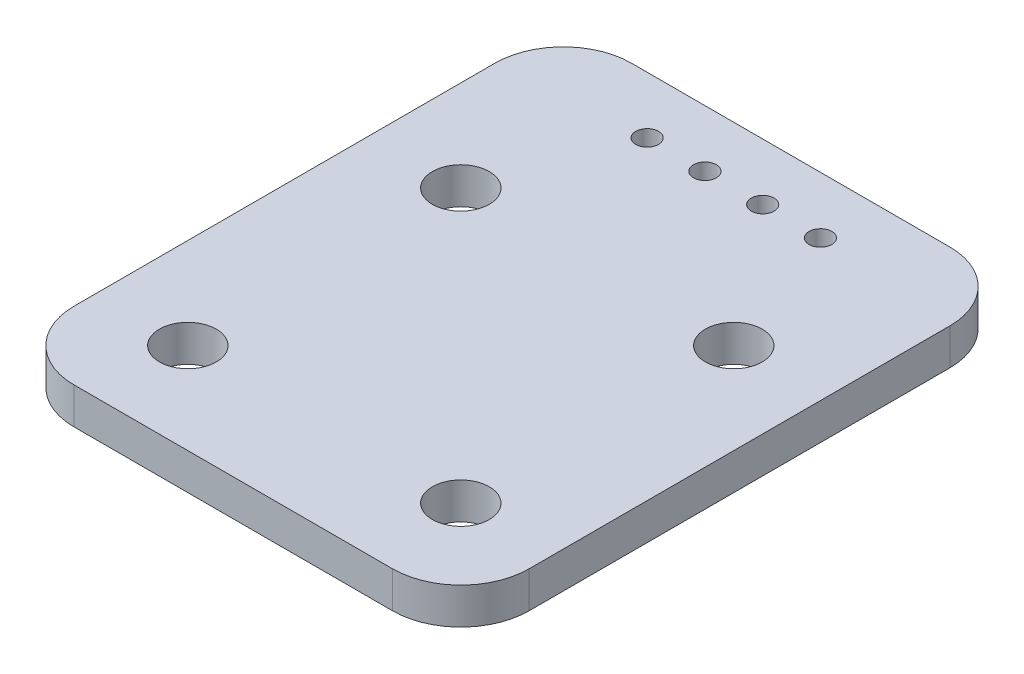
ISO-10303-21;
HEADER;
FILE_DESCRIPTION(('STEP AP214'),'2;1');
FILE_NAME('part.step','',(''),(''),'','','');
FILE_SCHEMA(('AUTOMOTIVE_DESIGN { 1 0 10303 214 1 1 1 1 }'));
ENDSEC;
DATA;
#1=APPLICATION_CONTEXT('core data for automotive mechanical design processes');
#2=APPLICATION_PROTOCOL_DEFINITION('international standard','automotive_design',2000,#1);
#3=PRODUCT_CONTEXT('',#1,'mechanical');
#4=PRODUCT('Part','Part','',(#3));
#5=PRODUCT_RELATED_PRODUCT_CATEGORY('part','',(#4));
#6=PRODUCT_DEFINITION_FORMATION('','',#4);
#7=PRODUCT_DEFINITION_CONTEXT('part definition',#1,'design');
#8=PRODUCT_DEFINITION('design','',#6,#7);
#9=PRODUCT_DEFINITION_SHAPE('','',#8);
#10=(LENGTH_UNIT() NAMED_UNIT(*) SI_UNIT(.MILLI.,.METRE.));
#11=(NAMED_UNIT(*) PLANE_ANGLE_UNIT() SI_UNIT($,.RADIAN.));
#12=(NAMED_UNIT(*) SI_UNIT($,.STERADIAN.) SOLID_ANGLE_UNIT());
#13=UNCERTAINTY_MEASURE_WITH_UNIT(LENGTH_MEASURE(1.E-05),#10,'distance_accuracy_value','');
#14=(GEOMETRIC_REPRESENTATION_CONTEXT(3) GLOBAL_UNCERTAINTY_ASSIGNED_CONTEXT((#13)) GLOBAL_UNIT_ASSIGNED_CONTEXT((#10,
#11,#12)) REPRESENTATION_CONTEXT('',''));
#15=CARTESIAN_POINT('',(0.,0.,0.));
#16=DIRECTION('',(0.,0.,1.));
#17=DIRECTION('',(1.,0.,0.));
#18=AXIS2_PLACEMENT_3D('',#15,#16,#17);
#19=CARTESIAN_POINT('',(10.,1.6,-12.25));
#20=DIRECTION('',(-1.,0.,0.));
#21=DIRECTION('',(0.,0.,1.));
#22=AXIS2_PLACEMENT_3D('',#19,#20,#21);
#23=PLANE('',#22);
#24=DIRECTION('',(0.,0.,-1.));
#25=VECTOR('',#24,1.);
#26=CARTESIAN_POINT('',(10.,0.,-12.25));
#27=LINE('',#26,#25);
#28=CARTESIAN_POINT('',(10.,0.,9.25));
#29=VERTEX_POINT('',#28);
#30=CARTESIAN_POINT('',(10.,0.,-9.25));
#31=VERTEX_POINT('',#30);
#32=EDGE_CURVE('E124',#29,#31,#27,.T.);
#33=ORIENTED_EDGE('',*,*,#32,.T.);
#34=DIRECTION('',(0.,-1.,0.));
#35=VECTOR('',#34,1.);
#36=CARTESIAN_POINT('',(10.,1.6,-9.25));
#37=LINE('',#36,#35);
#38=CARTESIAN_POINT('',(10.,1.6,-9.25));
#39=VERTEX_POINT('',#38);
#40=EDGE_CURVE('E102',#31,#39,#37,.F.);
#41=ORIENTED_EDGE('',*,*,#40,.T.);
#42=DIRECTION('',(0.,0.,-1.));
#43=VECTOR('',#42,1.);
#44=CARTESIAN_POINT('',(10.,1.6,-12.25));
#45=LINE('',#44,#43);
#46=CARTESIAN_POINT('',(10.,1.6,9.25));
#47=VERTEX_POINT('',#46);
#48=EDGE_CURVE('E134',#47,#39,#45,.T.);
#49=ORIENTED_EDGE('',*,*,#48,.F.);
#50=DIRECTION('',(0.,-1.,0.));
#51=VECTOR('',#50,1.);
#52=CARTESIAN_POINT('',(10.,1.6,9.25));
#53=LINE('',#52,#51);
#54=EDGE_CURVE('E107',#47,#29,#53,.T.);
#55=ORIENTED_EDGE('',*,*,#54,.T.);
#56=EDGE_LOOP('',(#33,#41,#49,#55));
#57=FACE_BOUND('',#56,.T.);
#58=ADVANCED_FACE('F32',(#57),#23,.F.);
#59=CARTESIAN_POINT('',(-10.,1.6,-12.25));
#60=DIRECTION('',(0.,0.,1.));
#61=DIRECTION('',(1.,0.,0.));
#62=AXIS2_PLACEMENT_3D('',#59,#60,#61);
#63=PLANE('',#62);
#64=DIRECTION('',(-1.,0.,0.));
#65=VECTOR('',#64,1.);
#66=CARTESIAN_POINT('',(-10.,1.6,-12.25));
#67=LINE('',#66,#65);
#68=CARTESIAN_POINT('',(7.,1.6,-12.25));
#69=VERTEX_POINT('',#68);
#70=CARTESIAN_POINT('',(-7.,1.6,-12.25));
#71=VERTEX_POINT('',#70);
#72=EDGE_CURVE('E117',#69,#71,#67,.T.);
#73=ORIENTED_EDGE('',*,*,#72,.F.);
#74=DIRECTION('',(0.,-1.,0.));
#75=VECTOR('',#74,1.);
#76=CARTESIAN_POINT('',(7.,1.6,-12.25));
#77=LINE('',#76,#75);
#78=CARTESIAN_POINT('',(7.,0.,-12.25));
#79=VERTEX_POINT('',#78);
#80=EDGE_CURVE('E101',#69,#79,#77,.T.);
#81=ORIENTED_EDGE('',*,*,#80,.T.);
#82=DIRECTION('',(-1.,0.,0.));
#83=VECTOR('',#82,1.);
#84=CARTESIAN_POINT('',(-10.,0.,-12.25));
#85=LINE('',#84,#83);
#86=CARTESIAN_POINT('',(-7.,0.,-12.25));
#87=VERTEX_POINT('',#86);
#88=EDGE_CURVE('E114',#79,#87,#85,.T.);
#89=ORIENTED_EDGE('',*,*,#88,.T.);
#90=DIRECTION('',(0.,-1.,0.));
#91=VECTOR('',#90,1.);
#92=CARTESIAN_POINT('',(-7.,1.6,-12.25));
#93=LINE('',#92,#91);
#94=EDGE_CURVE('E119',#87,#71,#93,.F.);
#95=ORIENTED_EDGE('',*,*,#94,.T.);
#96=EDGE_LOOP('',(#73,#81,#89,#95));
#97=FACE_BOUND('',#96,.T.);
#98=ADVANCED_FACE('F113',(#97),#63,.F.);
#99=CARTESIAN_POINT('',(-10.,1.6,-12.25));
#100=DIRECTION('',(1.,0.,0.));
#101=DIRECTION('',(0.,0.,-1.));
#102=AXIS2_PLACEMENT_3D('',#99,#100,#101);
#103=PLANE('',#102);
#104=DIRECTION('',(0.,0.,1.));
#105=VECTOR('',#104,1.);
#106=CARTESIAN_POINT('',(-10.,1.6,-12.25));
#107=LINE('',#106,#105);
#108=CARTESIAN_POINT('',(-10.,1.6,-9.25));
#109=VERTEX_POINT('',#108);
#110=CARTESIAN_POINT('',(-10.,1.6,9.25));
#111=VERTEX_POINT('',#110);
#112=EDGE_CURVE('E168',#109,#111,#107,.T.);
#113=ORIENTED_EDGE('',*,*,#112,.F.);
#114=DIRECTION('',(0.,-1.,0.));
#115=VECTOR('',#114,1.);
#116=CARTESIAN_POINT('',(-10.,1.6,-9.25));
#117=LINE('',#116,#115);
#118=CARTESIAN_POINT('',(-10.,0.,-9.25));
#119=VERTEX_POINT('',#118);
#120=EDGE_CURVE('E153',#109,#119,#117,.T.);
#121=ORIENTED_EDGE('',*,*,#120,.T.);
#122=DIRECTION('',(0.,0.,1.));
#123=VECTOR('',#122,1.);
#124=CARTESIAN_POINT('',(-10.,0.,-12.25));
#125=LINE('',#124,#123);
#126=CARTESIAN_POINT('',(-10.,0.,9.25));
#127=VERTEX_POINT('',#126);
#128=EDGE_CURVE('E123',#119,#127,#125,.T.);
#129=ORIENTED_EDGE('',*,*,#128,.T.);
#130=DIRECTION('',(0.,-1.,0.));
#131=VECTOR('',#130,1.);
#132=CARTESIAN_POINT('',(-10.,1.6,9.25));
#133=LINE('',#132,#131);
#134=EDGE_CURVE('E151',#127,#111,#133,.F.);
#135=ORIENTED_EDGE('',*,*,#134,.T.);
#136=EDGE_LOOP('',(#113,#121,#129,#135));
#137=FACE_BOUND('',#136,.T.);
#138=ADVANCED_FACE('F184',(#137),#103,.F.);
#139=CARTESIAN_POINT('',(-10.,1.6,12.25));
#140=DIRECTION('',(0.,0.,-1.));
#141=DIRECTION('',(-1.,0.,0.));
#142=AXIS2_PLACEMENT_3D('',#139,#140,#141);
#143=PLANE('',#142);
#144=DIRECTION('',(1.,0.,0.));
#145=VECTOR('',#144,1.);
#146=CARTESIAN_POINT('',(-10.,0.,12.25));
#147=LINE('',#146,#145);
#148=CARTESIAN_POINT('',(-7.,0.,12.25));
#149=VERTEX_POINT('',#148);
#150=CARTESIAN_POINT('',(7.,0.,12.25));
#151=VERTEX_POINT('',#150);
#152=EDGE_CURVE('E127',#149,#151,#147,.T.);
#153=ORIENTED_EDGE('',*,*,#152,.T.);
#154=DIRECTION('',(0.,-1.,0.));
#155=VECTOR('',#154,1.);
#156=CARTESIAN_POINT('',(7.,1.6,12.25));
#157=LINE('',#156,#155);
#158=CARTESIAN_POINT('',(7.,1.6,12.25));
#159=VERTEX_POINT('',#158);
#160=EDGE_CURVE('E11',#151,#159,#157,.F.);
#161=ORIENTED_EDGE('',*,*,#160,.T.);
#162=DIRECTION('',(1.,0.,0.));
#163=VECTOR('',#162,1.);
#164=CARTESIAN_POINT('',(-10.,1.6,12.25));
#165=LINE('',#164,#163);
#166=CARTESIAN_POINT('',(-7.,1.6,12.25));
#167=VERTEX_POINT('',#166);
#168=EDGE_CURVE('E135',#167,#159,#165,.T.);
#169=ORIENTED_EDGE('',*,*,#168,.F.);
#170=DIRECTION('',(0.,-1.,0.));
#171=VECTOR('',#170,1.);
#172=CARTESIAN_POINT('',(-7.,1.6,12.25));
#173=LINE('',#172,#171);
#174=EDGE_CURVE('E40',#167,#149,#173,.T.);
#175=ORIENTED_EDGE('',*,*,#174,.T.);
#176=EDGE_LOOP('',(#153,#161,#169,#175));
#177=FACE_BOUND('',#176,.T.);
#178=ADVANCED_FACE('F158',(#177),#143,.F.);
#179=CARTESIAN_POINT('',(0.,1.6,0.));
#180=DIRECTION('',(0.,1.,0.));
#181=DIRECTION('',(0.,0.,1.));
#182=AXIS2_PLACEMENT_3D('',#179,#180,#181);
#183=PLANE('',#182);
#184=CARTESIAN_POINT('',(-3.81,1.6,-9.75));
#185=DIRECTION('',(0.,1.,0.));
#186=DIRECTION('',(0.,0.,1.));
#187=AXIS2_PLACEMENT_3D('',#184,#185,#186);
#188=CIRCLE('',#187,0.5);
#189=CARTESIAN_POINT('',(-3.81,1.6,-9.25));
#190=VERTEX_POINT('',#189);
#191=EDGE_CURVE('E129',#190,#190,#188,.T.);
#192=ORIENTED_EDGE('',*,*,#191,.F.);
#193=EDGE_LOOP('',(#192));
#194=FACE_BOUND('',#193,.T.);
#195=CARTESIAN_POINT('',(-6.,1.6,-3.75));
#196=DIRECTION('',(0.,1.,0.));
#197=DIRECTION('',(0.,0.,1.));
#198=AXIS2_PLACEMENT_3D('',#195,#196,#197);
#199=CIRCLE('',#198,1.25);
#200=CARTESIAN_POINT('',(-6.,1.6,-2.5));
#201=VERTEX_POINT('',#200);
#202=EDGE_CURVE('E364',#201,#201,#199,.T.);
#203=ORIENTED_EDGE('',*,*,#202,.F.);
#204=EDGE_LOOP('',(#203));
#205=FACE_BOUND('',#204,.T.);
#206=CARTESIAN_POINT('',(-6.,1.6,8.25));
#207=DIRECTION('',(0.,1.,0.));
#208=DIRECTION('',(0.,0.,1.));
#209=AXIS2_PLACEMENT_3D('',#206,#207,#208);
#210=CIRCLE('',#209,1.25);
#211=CARTESIAN_POINT('',(-6.,1.6,9.5));
#212=VERTEX_POINT('',#211);
#213=EDGE_CURVE('E362',#212,#212,#210,.T.);
#214=ORIENTED_EDGE('',*,*,#213,.F.);
#215=EDGE_LOOP('',(#214));
#216=FACE_BOUND('',#215,.T.);
#217=CARTESIAN_POINT('',(6.,1.6,-3.75));
#218=DIRECTION('',(0.,1.,0.));
#219=DIRECTION('',(0.,0.,1.));
#220=AXIS2_PLACEMENT_3D('',#217,#218,#219);
#221=CIRCLE('',#220,1.25);
#222=CARTESIAN_POINT('',(6.,1.6,-2.5));
#223=VERTEX_POINT('',#222);
#224=EDGE_CURVE('E359',#223,#223,#221,.T.);
#225=ORIENTED_EDGE('',*,*,#224,.F.);
#226=EDGE_LOOP('',(#225));
#227=FACE_BOUND('',#226,.T.);
#228=CARTESIAN_POINT('',(-1.27,1.6,-9.75));
#229=DIRECTION('',(0.,1.,0.));
#230=DIRECTION('',(0.,0.,1.));
#231=AXIS2_PLACEMENT_3D('',#228,#229,#230);
#232=CIRCLE('',#231,0.5);
#233=CARTESIAN_POINT('',(-1.27,1.6,-9.25));
#234=VERTEX_POINT('',#233);
#235=EDGE_CURVE('E356',#234,#234,#232,.T.);
#236=ORIENTED_EDGE('',*,*,#235,.F.);
#237=EDGE_LOOP('',(#236));
#238=FACE_BOUND('',#237,.T.);
#239=CARTESIAN_POINT('',(1.27,1.6,-9.75));
#240=DIRECTION('',(0.,1.,0.));
#241=DIRECTION('',(0.,0.,1.));
#242=AXIS2_PLACEMENT_3D('',#239,#240,#241);
#243=CIRCLE('',#242,0.5);
#244=CARTESIAN_POINT('',(1.27,1.6,-9.25));
#245=VERTEX_POINT('',#244);
#246=EDGE_CURVE('E353',#245,#245,#243,.T.);
#247=ORIENTED_EDGE('',*,*,#246,.F.);
#248=EDGE_LOOP('',(#247));
#249=FACE_BOUND('',#248,.T.);
#250=CARTESIAN_POINT('',(3.81,1.6,-9.75000000000001));
#251=DIRECTION('',(0.,1.,0.));
#252=DIRECTION('',(0.,0.,1.));
#253=AXIS2_PLACEMENT_3D('',#250,#251,#252);
#254=CIRCLE('',#253,0.5);
#255=CARTESIAN_POINT('',(3.81,1.6,-9.25000000000001));
#256=VERTEX_POINT('',#255);
#257=EDGE_CURVE('E344',#256,#256,#254,.T.);
#258=ORIENTED_EDGE('',*,*,#257,.F.);
#259=EDGE_LOOP('',(#258));
#260=FACE_BOUND('',#259,.T.);
#261=CARTESIAN_POINT('',(6.,1.6,8.25));
#262=DIRECTION('',(0.,1.,0.));
#263=DIRECTION('',(0.,0.,1.));
#264=AXIS2_PLACEMENT_3D('',#261,#262,#263);
#265=CIRCLE('',#264,1.25);
#266=CARTESIAN_POINT('',(6.,1.6,9.5));
#267=VERTEX_POINT('',#266);
#268=EDGE_CURVE('E337',#267,#267,#265,.T.);
#269=ORIENTED_EDGE('',*,*,#268,.F.);
#270=EDGE_LOOP('',(#269));
#271=FACE_BOUND('',#270,.T.);
#272=ORIENTED_EDGE('',*,*,#48,.T.);
#273=CARTESIAN_POINT('',(7.,1.6,-9.25));
#274=DIRECTION('',(0.,1.,0.));
#275=DIRECTION('',(0.,0.,1.));
#276=AXIS2_PLACEMENT_3D('',#273,#274,#275);
#277=CIRCLE('',#276,3.);
#278=EDGE_CURVE('E149',#39,#69,#277,.T.);
#279=ORIENTED_EDGE('',*,*,#278,.T.);
#280=ORIENTED_EDGE('',*,*,#72,.T.);
#281=CARTESIAN_POINT('',(-7.,1.6,-9.25));
#282=DIRECTION('',(0.,1.,0.));
#283=DIRECTION('',(0.,0.,1.));
#284=AXIS2_PLACEMENT_3D('',#281,#282,#283);
#285=CIRCLE('',#284,3.);
#286=EDGE_CURVE('E147',#71,#109,#285,.T.);
#287=ORIENTED_EDGE('',*,*,#286,.T.);
#288=ORIENTED_EDGE('',*,*,#112,.T.);
#289=CARTESIAN_POINT('',(-7.,1.6,9.25));
#290=DIRECTION('',(0.,1.,0.));
#291=DIRECTION('',(0.,0.,1.));
#292=AXIS2_PLACEMENT_3D('',#289,#290,#291);
#293=CIRCLE('',#292,3.);
#294=EDGE_CURVE('E52',#111,#167,#293,.T.);
#295=ORIENTED_EDGE('',*,*,#294,.T.);
#296=ORIENTED_EDGE('',*,*,#168,.T.);
#297=CARTESIAN_POINT('',(7.,1.6,9.25));
#298=DIRECTION('',(0.,1.,0.));
#299=DIRECTION('',(0.,0.,1.));
#300=AXIS2_PLACEMENT_3D('',#297,#298,#299);
#301=CIRCLE('',#300,3.);
#302=EDGE_CURVE('E145',#159,#47,#301,.T.);
#303=ORIENTED_EDGE('',*,*,#302,.T.);
#304=EDGE_LOOP('',(#272,#279,#280,#287,#288,#295,#296,#303));
#305=FACE_BOUND('',#304,.T.);
#306=ADVANCED_FACE('F173',(#194,#205,#216,#227,#238,#249,#260,#271,#305),#183,.T.);
#307=CARTESIAN_POINT('',(0.,0.,0.));
#308=DIRECTION('',(0.,1.,0.));
#309=DIRECTION('',(0.,0.,1.));
#310=AXIS2_PLACEMENT_3D('',#307,#308,#309);
#311=PLANE('',#310);
#312=CARTESIAN_POINT('',(-3.81,0.,-9.75));
#313=DIRECTION('',(0.,1.,0.));
#314=DIRECTION('',(0.,0.,1.));
#315=AXIS2_PLACEMENT_3D('',#312,#313,#314);
#316=CIRCLE('',#315,0.5);
#317=CARTESIAN_POINT('',(-3.81,0.,-9.25));
#318=VERTEX_POINT('',#317);
#319=EDGE_CURVE('E371',#318,#318,#316,.T.);
#320=ORIENTED_EDGE('',*,*,#319,.T.);
#321=EDGE_LOOP('',(#320));
#322=FACE_BOUND('',#321,.T.);
#323=CARTESIAN_POINT('',(-6.,0.,-3.75));
#324=DIRECTION('',(0.,1.,0.));
#325=DIRECTION('',(0.,0.,1.));
#326=AXIS2_PLACEMENT_3D('',#323,#324,#325);
#327=CIRCLE('',#326,1.25);
#328=CARTESIAN_POINT('',(-6.,0.,-2.5));
#329=VERTEX_POINT('',#328);
#330=EDGE_CURVE('E372',#329,#329,#327,.T.);
#331=ORIENTED_EDGE('',*,*,#330,.T.);
#332=EDGE_LOOP('',(#331));
#333=FACE_BOUND('',#332,.T.);
#334=CARTESIAN_POINT('',(-6.,0.,8.25));
#335=DIRECTION('',(0.,1.,0.));
#336=DIRECTION('',(0.,0.,1.));
#337=AXIS2_PLACEMENT_3D('',#334,#335,#336);
#338=CIRCLE('',#337,1.25);
#339=CARTESIAN_POINT('',(-6.,0.,9.5));
#340=VERTEX_POINT('',#339);
#341=EDGE_CURVE('E347',#340,#340,#338,.T.);
#342=ORIENTED_EDGE('',*,*,#341,.T.);
#343=EDGE_LOOP('',(#342));
#344=FACE_BOUND('',#343,.T.);
#345=CARTESIAN_POINT('',(6.,0.,-3.75));
#346=DIRECTION('',(0.,1.,0.));
#347=DIRECTION('',(0.,0.,1.));
#348=AXIS2_PLACEMENT_3D('',#345,#346,#347);
#349=CIRCLE('',#348,1.25);
#350=CARTESIAN_POINT('',(6.,0.,-2.5));
#351=VERTEX_POINT('',#350);
#352=EDGE_CURVE('E342',#351,#351,#349,.T.);
#353=ORIENTED_EDGE('',*,*,#352,.T.);
#354=EDGE_LOOP('',(#353));
#355=FACE_BOUND('',#354,.T.);
#356=CARTESIAN_POINT('',(-1.27,0.,-9.75));
#357=DIRECTION('',(0.,1.,0.));
#358=DIRECTION('',(0.,0.,1.));
#359=AXIS2_PLACEMENT_3D('',#356,#357,#358);
#360=CIRCLE('',#359,0.5);
#361=CARTESIAN_POINT('',(-1.27,0.,-9.25));
#362=VERTEX_POINT('',#361);
#363=EDGE_CURVE('E373',#362,#362,#360,.T.);
#364=ORIENTED_EDGE('',*,*,#363,.T.);
#365=EDGE_LOOP('',(#364));
#366=FACE_BOUND('',#365,.T.);
#367=CARTESIAN_POINT('',(1.27,0.,-9.75));
#368=DIRECTION('',(0.,1.,0.));
#369=DIRECTION('',(0.,0.,1.));
#370=AXIS2_PLACEMENT_3D('',#367,#368,#369);
#371=CIRCLE('',#370,0.5);
#372=CARTESIAN_POINT('',(1.27,0.,-9.25));
#373=VERTEX_POINT('',#372);
#374=EDGE_CURVE('E378',#373,#373,#371,.T.);
#375=ORIENTED_EDGE('',*,*,#374,.T.);
#376=EDGE_LOOP('',(#375));
#377=FACE_BOUND('',#376,.T.);
#378=CARTESIAN_POINT('',(3.81,0.,-9.75000000000001));
#379=DIRECTION('',(0.,1.,0.));
#380=DIRECTION('',(0.,0.,1.));
#381=AXIS2_PLACEMENT_3D('',#378,#379,#380);
#382=CIRCLE('',#381,0.5);
#383=CARTESIAN_POINT('',(3.81,0.,-9.25000000000001));
#384=VERTEX_POINT('',#383);
#385=EDGE_CURVE('E381',#384,#384,#382,.T.);
#386=ORIENTED_EDGE('',*,*,#385,.T.);
#387=EDGE_LOOP('',(#386));
#388=FACE_BOUND('',#387,.T.);
#389=CARTESIAN_POINT('',(6.,0.,8.25));
#390=DIRECTION('',(0.,1.,0.));
#391=DIRECTION('',(0.,0.,1.));
#392=AXIS2_PLACEMENT_3D('',#389,#390,#391);
#393=CIRCLE('',#392,1.25);
#394=CARTESIAN_POINT('',(6.,0.,9.5));
#395=VERTEX_POINT('',#394);
#396=EDGE_CURVE('E340',#395,#395,#393,.T.);
#397=ORIENTED_EDGE('',*,*,#396,.T.);
#398=EDGE_LOOP('',(#397));
#399=FACE_BOUND('',#398,.T.);
#400=ORIENTED_EDGE('',*,*,#88,.F.);
#401=CARTESIAN_POINT('',(7.,0.,-9.25));
#402=DIRECTION('',(0.,1.,0.));
#403=DIRECTION('',(0.,0.,1.));
#404=AXIS2_PLACEMENT_3D('',#401,#402,#403);
#405=CIRCLE('',#404,3.);
#406=EDGE_CURVE('E97',#79,#31,#405,.F.);
#407=ORIENTED_EDGE('',*,*,#406,.T.);
#408=ORIENTED_EDGE('',*,*,#32,.F.);
#409=CARTESIAN_POINT('',(7.,0.,9.25));
#410=DIRECTION('',(0.,1.,0.));
#411=DIRECTION('',(0.,0.,1.));
#412=AXIS2_PLACEMENT_3D('',#409,#410,#411);
#413=CIRCLE('',#412,3.);
#414=EDGE_CURVE('E138',#29,#151,#413,.F.);
#415=ORIENTED_EDGE('',*,*,#414,.T.);
#416=ORIENTED_EDGE('',*,*,#152,.F.);
#417=CARTESIAN_POINT('',(-7.,0.,9.25));
#418=DIRECTION('',(0.,1.,0.));
#419=DIRECTION('',(0.,0.,1.));
#420=AXIS2_PLACEMENT_3D('',#417,#418,#419);
#421=CIRCLE('',#420,3.);
#422=EDGE_CURVE('E118',#149,#127,#421,.F.);
#423=ORIENTED_EDGE('',*,*,#422,.T.);
#424=ORIENTED_EDGE('',*,*,#128,.F.);
#425=CARTESIAN_POINT('',(-7.,0.,-9.25));
#426=DIRECTION('',(0.,1.,0.));
#427=DIRECTION('',(0.,0.,1.));
#428=AXIS2_PLACEMENT_3D('',#425,#426,#427);
#429=CIRCLE('',#428,3.);
#430=EDGE_CURVE('E108',#119,#87,#429,.F.);
#431=ORIENTED_EDGE('',*,*,#430,.T.);
#432=EDGE_LOOP('',(#400,#407,#408,#415,#416,#423,#424,#431));
#433=FACE_BOUND('',#432,.T.);
#434=ADVANCED_FACE('F121',(#322,#333,#344,#355,#366,#377,#388,#399,#433),#311,.F.);
#435=CARTESIAN_POINT('',(6.,0.,8.25));
#436=DIRECTION('',(0.,1.,0.));
#437=DIRECTION('',(0.,0.,1.));
#438=AXIS2_PLACEMENT_3D('',#435,#436,#437);
#439=CYLINDRICAL_SURFACE('',#438,1.25);
#440=ORIENTED_EDGE('',*,*,#268,.T.);
#441=EDGE_LOOP('',(#440));
#442=FACE_BOUND('',#441,.T.);
#443=ORIENTED_EDGE('',*,*,#396,.F.);
#444=EDGE_LOOP('',(#443));
#445=FACE_BOUND('',#444,.T.);
#446=ADVANCED_FACE('F181',(#442,#445),#439,.F.);
#447=CARTESIAN_POINT('',(3.81,0.,-9.75000000000001));
#448=DIRECTION('',(0.,1.,0.));
#449=DIRECTION('',(0.,0.,1.));
#450=AXIS2_PLACEMENT_3D('',#447,#448,#449);
#451=CYLINDRICAL_SURFACE('',#450,0.5);
#452=ORIENTED_EDGE('',*,*,#257,.T.);
#453=EDGE_LOOP('',(#452));
#454=FACE_BOUND('',#453,.T.);
#455=ORIENTED_EDGE('',*,*,#385,.F.);
#456=EDGE_LOOP('',(#455));
#457=FACE_BOUND('',#456,.T.);
#458=ADVANCED_FACE('F303',(#454,#457),#451,.F.);
#459=CARTESIAN_POINT('',(1.27,0.,-9.75));
#460=DIRECTION('',(0.,1.,0.));
#461=DIRECTION('',(0.,0.,1.));
#462=AXIS2_PLACEMENT_3D('',#459,#460,#461);
#463=CYLINDRICAL_SURFACE('',#462,0.5);
#464=ORIENTED_EDGE('',*,*,#246,.T.);
#465=EDGE_LOOP('',(#464));
#466=FACE_BOUND('',#465,.T.);
#467=ORIENTED_EDGE('',*,*,#374,.F.);
#468=EDGE_LOOP('',(#467));
#469=FACE_BOUND('',#468,.T.);
#470=ADVANCED_FACE('F295',(#466,#469),#463,.F.);
#471=CARTESIAN_POINT('',(-1.27,0.,-9.75));
#472=DIRECTION('',(0.,1.,0.));
#473=DIRECTION('',(0.,0.,1.));
#474=AXIS2_PLACEMENT_3D('',#471,#472,#473);
#475=CYLINDRICAL_SURFACE('',#474,0.5);
#476=ORIENTED_EDGE('',*,*,#235,.T.);
#477=EDGE_LOOP('',(#476));
#478=FACE_BOUND('',#477,.T.);
#479=ORIENTED_EDGE('',*,*,#363,.F.);
#480=EDGE_LOOP('',(#479));
#481=FACE_BOUND('',#480,.T.);
#482=ADVANCED_FACE('F287',(#478,#481),#475,.F.);
#483=CARTESIAN_POINT('',(6.,0.,-3.75));
#484=DIRECTION('',(0.,1.,0.));
#485=DIRECTION('',(0.,0.,1.));
#486=AXIS2_PLACEMENT_3D('',#483,#484,#485);
#487=CYLINDRICAL_SURFACE('',#486,1.25);
#488=ORIENTED_EDGE('',*,*,#224,.T.);
#489=EDGE_LOOP('',(#488));
#490=FACE_BOUND('',#489,.T.);
#491=ORIENTED_EDGE('',*,*,#352,.F.);
#492=EDGE_LOOP('',(#491));
#493=FACE_BOUND('',#492,.T.);
#494=ADVANCED_FACE('F279',(#490,#493),#487,.F.);
#495=CARTESIAN_POINT('',(-6.,0.,8.25));
#496=DIRECTION('',(0.,1.,0.));
#497=DIRECTION('',(0.,0.,1.));
#498=AXIS2_PLACEMENT_3D('',#495,#496,#497);
#499=CYLINDRICAL_SURFACE('',#498,1.25);
#500=ORIENTED_EDGE('',*,*,#213,.T.);
#501=EDGE_LOOP('',(#500));
#502=FACE_BOUND('',#501,.T.);
#503=ORIENTED_EDGE('',*,*,#341,.F.);
#504=EDGE_LOOP('',(#503));
#505=FACE_BOUND('',#504,.T.);
#506=ADVANCED_FACE('F271',(#502,#505),#499,.F.);
#507=CARTESIAN_POINT('',(-6.,0.,-3.75));
#508=DIRECTION('',(0.,1.,0.));
#509=DIRECTION('',(0.,0.,1.));
#510=AXIS2_PLACEMENT_3D('',#507,#508,#509);
#511=CYLINDRICAL_SURFACE('',#510,1.25);
#512=ORIENTED_EDGE('',*,*,#202,.T.);
#513=EDGE_LOOP('',(#512));
#514=FACE_BOUND('',#513,.T.);
#515=ORIENTED_EDGE('',*,*,#330,.F.);
#516=EDGE_LOOP('',(#515));
#517=FACE_BOUND('',#516,.T.);
#518=ADVANCED_FACE('F264',(#514,#517),#511,.F.);
#519=CARTESIAN_POINT('',(-3.81,0.,-9.75));
#520=DIRECTION('',(0.,1.,0.));
#521=DIRECTION('',(0.,0.,1.));
#522=AXIS2_PLACEMENT_3D('',#519,#520,#521);
#523=CYLINDRICAL_SURFACE('',#522,0.5);
#524=ORIENTED_EDGE('',*,*,#191,.T.);
#525=EDGE_LOOP('',(#524));
#526=FACE_BOUND('',#525,.T.);
#527=ORIENTED_EDGE('',*,*,#319,.F.);
#528=EDGE_LOOP('',(#527));
#529=FACE_BOUND('',#528,.T.);
#530=ADVANCED_FACE('F200',(#526,#529),#523,.F.);
#531=CARTESIAN_POINT('',(7.,1.6,-9.25));
#532=DIRECTION('',(0.,-1.,0.));
#533=DIRECTION('',(0.,0.,-1.));
#534=AXIS2_PLACEMENT_3D('',#531,#532,#533);
#535=CYLINDRICAL_SURFACE('',#534,3.);
#536=ORIENTED_EDGE('',*,*,#278,.F.);
#537=ORIENTED_EDGE('',*,*,#40,.F.);
#538=ORIENTED_EDGE('',*,*,#406,.F.);
#539=ORIENTED_EDGE('',*,*,#80,.F.);
#540=EDGE_LOOP('',(#536,#537,#538,#539));
#541=FACE_BOUND('',#540,.T.);
#542=ADVANCED_FACE('F100',(#541),#535,.T.);
#543=CARTESIAN_POINT('',(-7.,1.6,-9.25));
#544=DIRECTION('',(0.,-1.,0.));
#545=DIRECTION('',(0.,0.,-1.));
#546=AXIS2_PLACEMENT_3D('',#543,#544,#545);
#547=CYLINDRICAL_SURFACE('',#546,3.);
#548=ORIENTED_EDGE('',*,*,#286,.F.);
#549=ORIENTED_EDGE('',*,*,#94,.F.);
#550=ORIENTED_EDGE('',*,*,#430,.F.);
#551=ORIENTED_EDGE('',*,*,#120,.F.);
#552=EDGE_LOOP('',(#548,#549,#550,#551));
#553=FACE_BOUND('',#552,.T.);
#554=ADVANCED_FACE('F199',(#553),#547,.T.);
#555=CARTESIAN_POINT('',(7.,1.6,9.25));
#556=DIRECTION('',(0.,-1.,0.));
#557=DIRECTION('',(0.,0.,-1.));
#558=AXIS2_PLACEMENT_3D('',#555,#556,#557);
#559=CYLINDRICAL_SURFACE('',#558,3.);
#560=ORIENTED_EDGE('',*,*,#302,.F.);
#561=ORIENTED_EDGE('',*,*,#160,.F.);
#562=ORIENTED_EDGE('',*,*,#414,.F.);
#563=ORIENTED_EDGE('',*,*,#54,.F.);
#564=EDGE_LOOP('',(#560,#561,#562,#563));
#565=FACE_BOUND('',#564,.T.);
#566=ADVANCED_FACE('F163',(#565),#559,.T.);
#567=CARTESIAN_POINT('',(-7.,1.6,9.25));
#568=DIRECTION('',(0.,-1.,0.));
#569=DIRECTION('',(0.,0.,-1.));
#570=AXIS2_PLACEMENT_3D('',#567,#568,#569);
#571=CYLINDRICAL_SURFACE('',#570,3.);
#572=ORIENTED_EDGE('',*,*,#294,.F.);
#573=ORIENTED_EDGE('',*,*,#134,.F.);
#574=ORIENTED_EDGE('',*,*,#422,.F.);
#575=ORIENTED_EDGE('',*,*,#174,.F.);
#576=EDGE_LOOP('',(#572,#573,#574,#575));
#577=FACE_BOUND('',#576,.T.);
#578=ADVANCED_FACE('F34',(#577),#571,.T.);
#579=CLOSED_SHELL('',(#58,#98,#138,#178,#306,#434,#446,#458,#470,#482,#494,#506,#518,#530,#542,
#554,#566,#578));
#580=MANIFOLD_SOLID_BREP('B2',#579);
#581=ADVANCED_BREP_SHAPE_REPRESENTATION('',(#18,#580),#14);
#582=SHAPE_DEFINITION_REPRESENTATION(#9,#581);
ENDSEC;
END-ISO-10303-21;
